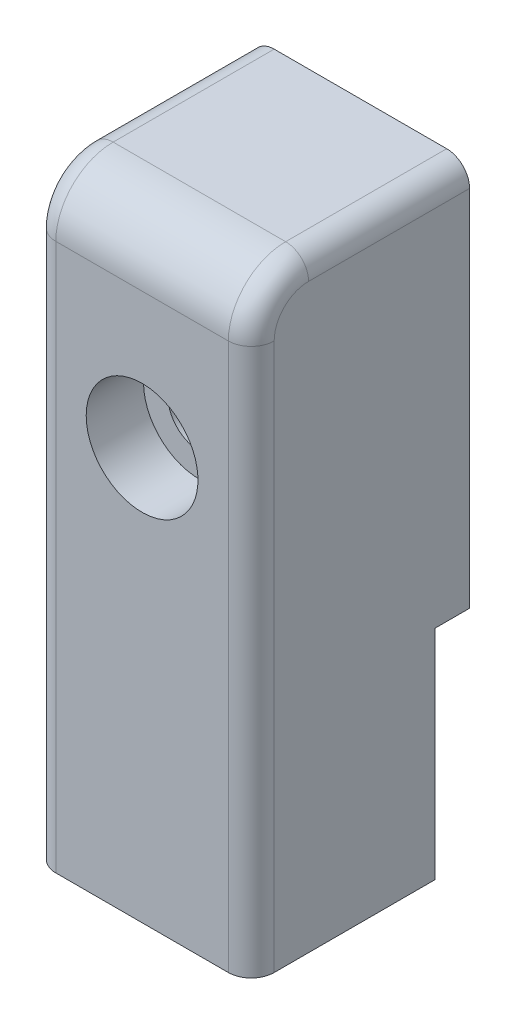
ISO-10303-21;
HEADER;
FILE_DESCRIPTION(('STEP AP214'),'2;1');
FILE_NAME('part.step','',(''),(''),'','','');
FILE_SCHEMA(('AUTOMOTIVE_DESIGN { 1 0 10303 214 1 1 1 1 }'));
ENDSEC;
DATA;
#1=APPLICATION_CONTEXT('core data for automotive mechanical design processes');
#2=APPLICATION_PROTOCOL_DEFINITION('international standard','automotive_design',2000,#1);
#3=PRODUCT_CONTEXT('',#1,'mechanical');
#4=PRODUCT('Part','Part','',(#3));
#5=PRODUCT_RELATED_PRODUCT_CATEGORY('part','',(#4));
#6=PRODUCT_DEFINITION_FORMATION('','',#4);
#7=PRODUCT_DEFINITION_CONTEXT('part definition',#1,'design');
#8=PRODUCT_DEFINITION('design','',#6,#7);
#9=PRODUCT_DEFINITION_SHAPE('','',#8);
#10=(LENGTH_UNIT() NAMED_UNIT(*) SI_UNIT(.MILLI.,.METRE.));
#11=(NAMED_UNIT(*) PLANE_ANGLE_UNIT() SI_UNIT($,.RADIAN.));
#12=(NAMED_UNIT(*) SI_UNIT($,.STERADIAN.) SOLID_ANGLE_UNIT());
#13=UNCERTAINTY_MEASURE_WITH_UNIT(LENGTH_MEASURE(1.E-05),#10,'distance_accuracy_value','');
#14=(GEOMETRIC_REPRESENTATION_CONTEXT(3) GLOBAL_UNCERTAINTY_ASSIGNED_CONTEXT((#13)) GLOBAL_UNIT_ASSIGNED_CONTEXT((#10,
#11,#12)) REPRESENTATION_CONTEXT('',''));
#15=CARTESIAN_POINT('',(0.,0.,0.));
#16=DIRECTION('',(0.,0.,1.));
#17=DIRECTION('',(1.,0.,0.));
#18=AXIS2_PLACEMENT_3D('',#15,#16,#17);
#19=CARTESIAN_POINT('',(276.487457350126,52.72,7.9993613968678));
#20=DIRECTION('',(0.,1.,0.));
#21=DIRECTION('',(1.,0.,0.));
#22=AXIS2_PLACEMENT_3D('',#19,#20,#21);
#23=PLANE('',#22);
#24=DIRECTION('',(0.,0.,1.));
#25=VECTOR('',#24,1.);
#26=CARTESIAN_POINT('',(284.012457350126,52.72,12.7618613968678));
#27=LINE('',#26,#25);
#28=CARTESIAN_POINT('',(284.012457350126,52.72,-1.5256386031322));
#29=VERTEX_POINT('',#28);
#30=CARTESIAN_POINT('',(284.012457350126,52.72,12.5243613968678));
#31=VERTEX_POINT('',#30);
#32=EDGE_CURVE('E223',#29,#31,#27,.T.);
#33=ORIENTED_EDGE('',*,*,#32,.F.);
#34=DIRECTION('',(-1.,0.,0.));
#35=VECTOR('',#34,1.);
#36=CARTESIAN_POINT('',(266.962457350126,52.72,-1.5256386031322));
#37=LINE('',#36,#35);
#38=CARTESIAN_POINT('',(268.962457350126,52.72,-1.5256386031322));
#39=VERTEX_POINT('',#38);
#40=EDGE_CURVE('E11',#29,#39,#37,.T.);
#41=ORIENTED_EDGE('',*,*,#40,.T.);
#42=DIRECTION('',(0.,0.,-1.));
#43=VECTOR('',#42,1.);
#44=CARTESIAN_POINT('',(268.962457350126,52.72,3.2368613968678));
#45=LINE('',#44,#43);
#46=CARTESIAN_POINT('',(268.962457350126,52.72,12.5243613968678));
#47=VERTEX_POINT('',#46);
#48=EDGE_CURVE('E262',#47,#39,#45,.T.);
#49=ORIENTED_EDGE('',*,*,#48,.F.);
#50=DIRECTION('',(-1.,0.,0.));
#51=VECTOR('',#50,1.);
#52=CARTESIAN_POINT('',(271.724957350126,52.72,12.5243613968678));
#53=LINE('',#52,#51);
#54=EDGE_CURVE('E248',#31,#47,#53,.T.);
#55=ORIENTED_EDGE('',*,*,#54,.F.);
#56=EDGE_LOOP('',(#33,#41,#49,#55));
#57=FACE_BOUND('',#56,.T.);
#58=ADVANCED_FACE('F17',(#57),#23,.T.);
#59=CARTESIAN_POINT('',(286.012457350126,0.,17.5243613968678));
#60=DIRECTION('',(1.,0.,0.));
#61=DIRECTION('',(0.,1.,0.));
#62=AXIS2_PLACEMENT_3D('',#59,#60,#61);
#63=PLANE('',#62);
#64=DIRECTION('',(0.,1.,0.));
#65=VECTOR('',#64,1.);
#66=CARTESIAN_POINT('',(286.012457350126,0.,15.5243613968678));
#67=LINE('',#66,#65);
#68=CARTESIAN_POINT('',(286.012457350126,0.,15.5243613968678));
#69=VERTEX_POINT('',#68);
#70=CARTESIAN_POINT('',(286.012457350126,47.72,15.5243613968678));
#71=VERTEX_POINT('',#70);
#72=EDGE_CURVE('E306',#69,#71,#67,.T.);
#73=ORIENTED_EDGE('',*,*,#72,.F.);
#74=DIRECTION('',(0.,0.,1.));
#75=VECTOR('',#74,1.);
#76=CARTESIAN_POINT('',(286.012457350126,0.,-1.5256386031322));
#77=LINE('',#76,#75);
#78=CARTESIAN_POINT('',(286.012457350126,0.,1.4743613968678));
#79=VERTEX_POINT('',#78);
#80=EDGE_CURVE('E167',#79,#69,#77,.T.);
#81=ORIENTED_EDGE('',*,*,#80,.F.);
#82=DIRECTION('',(0.,1.,0.));
#83=VECTOR('',#82,1.);
#84=CARTESIAN_POINT('',(286.012457350126,0.,1.4743613968678));
#85=LINE('',#84,#83);
#86=CARTESIAN_POINT('',(286.012457350126,19.,1.4743613968678));
#87=VERTEX_POINT('',#86);
#88=EDGE_CURVE('E165',#79,#87,#85,.T.);
#89=ORIENTED_EDGE('',*,*,#88,.T.);
#90=DIRECTION('',(0.,0.,-1.));
#91=VECTOR('',#90,1.);
#92=CARTESIAN_POINT('',(286.012457350126,19.,9.4993613968678));
#93=LINE('',#92,#91);
#94=CARTESIAN_POINT('',(286.012457350126,19.,-1.5256386031322));
#95=VERTEX_POINT('',#94);
#96=EDGE_CURVE('E209',#87,#95,#93,.T.);
#97=ORIENTED_EDGE('',*,*,#96,.T.);
#98=DIRECTION('',(0.,1.,0.));
#99=VECTOR('',#98,1.);
#100=CARTESIAN_POINT('',(286.012457350126,0.,-1.5256386031322));
#101=LINE('',#100,#99);
#102=CARTESIAN_POINT('',(286.012457350126,50.72,-1.5256386031322));
#103=VERTEX_POINT('',#102);
#104=EDGE_CURVE('E21',#95,#103,#101,.T.);
#105=ORIENTED_EDGE('',*,*,#104,.T.);
#106=DIRECTION('',(0.,0.,-1.));
#107=VECTOR('',#106,1.);
#108=CARTESIAN_POINT('',(286.012457350126,50.72,12.7618613968678));
#109=LINE('',#108,#107);
#110=CARTESIAN_POINT('',(286.012457350126,50.72,12.5243613968678));
#111=VERTEX_POINT('',#110);
#112=EDGE_CURVE('E228',#111,#103,#109,.T.);
#113=ORIENTED_EDGE('',*,*,#112,.F.);
#114=CARTESIAN_POINT('',(286.012457350126,47.72,12.5243613968678));
#115=DIRECTION('',(-1.,0.,0.));
#116=DIRECTION('',(0.,0.707106781186548,0.707106781186547));
#117=AXIS2_PLACEMENT_3D('',#114,#115,#116);
#118=CIRCLE('',#117,3.);
#119=EDGE_CURVE('E321',#71,#111,#118,.T.);
#120=ORIENTED_EDGE('',*,*,#119,.F.);
#121=EDGE_LOOP('',(#73,#81,#89,#97,#105,#113,#120));
#122=FACE_BOUND('',#121,.T.);
#123=ADVANCED_FACE('F19',(#122),#63,.T.);
#124=CARTESIAN_POINT('',(286.012457350126,0.,-1.5256386031322));
#125=DIRECTION('',(0.,0.,-1.));
#126=DIRECTION('',(0.,-1.,0.));
#127=AXIS2_PLACEMENT_3D('',#124,#125,#126);
#128=PLANE('',#127);
#129=CARTESIAN_POINT('',(276.487457350126,35.885,-1.5256386031322));
#130=DIRECTION('',(0.,0.,1.));
#131=DIRECTION('',(1.,0.,0.));
#132=AXIS2_PLACEMENT_3D('',#129,#130,#131);
#133=CIRCLE('',#132,2.75);
#134=CARTESIAN_POINT('',(273.737457350126,35.885,-1.5256386031322));
#135=VERTEX_POINT('',#134);
#136=EDGE_CURVE('E205',#135,#135,#133,.T.);
#137=ORIENTED_EDGE('',*,*,#136,.T.);
#138=EDGE_LOOP('',(#137));
#139=FACE_BOUND('',#138,.T.);
#140=CARTESIAN_POINT('',(284.012457350126,50.72,-1.5256386031322));
#141=DIRECTION('',(0.,0.,1.));
#142=DIRECTION('',(0.707106781186538,0.707106781186557,0.));
#143=AXIS2_PLACEMENT_3D('',#140,#141,#142);
#144=CIRCLE('',#143,2.);
#145=EDGE_CURVE('E224',#103,#29,#144,.T.);
#146=ORIENTED_EDGE('',*,*,#145,.F.);
#147=ORIENTED_EDGE('',*,*,#104,.F.);
#148=DIRECTION('',(-1.,0.,0.));
#149=VECTOR('',#148,1.);
#150=CARTESIAN_POINT('',(286.012457350126,19.,-1.5256386031322));
#151=LINE('',#150,#149);
#152=CARTESIAN_POINT('',(266.962457350126,19.,-1.5256386031322));
#153=VERTEX_POINT('',#152);
#154=EDGE_CURVE('E207',#95,#153,#151,.T.);
#155=ORIENTED_EDGE('',*,*,#154,.T.);
#156=DIRECTION('',(0.,1.,0.));
#157=VECTOR('',#156,1.);
#158=CARTESIAN_POINT('',(266.962457350126,0.,-1.5256386031322));
#159=LINE('',#158,#157);
#160=CARTESIAN_POINT('',(266.962457350126,50.72,-1.5256386031322));
#161=VERTEX_POINT('',#160);
#162=EDGE_CURVE('E187',#153,#161,#159,.T.);
#163=ORIENTED_EDGE('',*,*,#162,.T.);
#164=CARTESIAN_POINT('',(268.962457350126,50.72,-1.5256386031322));
#165=DIRECTION('',(0.,0.,1.));
#166=DIRECTION('',(-0.707106781186538,0.707106781186557,0.));
#167=AXIS2_PLACEMENT_3D('',#164,#165,#166);
#168=CIRCLE('',#167,2.);
#169=EDGE_CURVE('E260',#39,#161,#168,.T.);
#170=ORIENTED_EDGE('',*,*,#169,.F.);
#171=ORIENTED_EDGE('',*,*,#40,.F.);
#172=EDGE_LOOP('',(#146,#147,#155,#163,#170,#171));
#173=FACE_BOUND('',#172,.T.);
#174=ADVANCED_FACE('F292',(#139,#173),#128,.T.);
#175=CARTESIAN_POINT('',(286.012457350126,19.,1.4743613968678));
#176=DIRECTION('',(0.,1.,0.));
#177=DIRECTION('',(1.,0.,0.));
#178=AXIS2_PLACEMENT_3D('',#175,#176,#177);
#179=PLANE('',#178);
#180=DIRECTION('',(0.,0.,1.));
#181=VECTOR('',#180,1.);
#182=CARTESIAN_POINT('',(266.962457350126,19.,-0.0256386031322042));
#183=LINE('',#182,#181);
#184=CARTESIAN_POINT('',(266.962457350126,19.,1.4743613968678));
#185=VERTEX_POINT('',#184);
#186=EDGE_CURVE('E155',#153,#185,#183,.T.);
#187=ORIENTED_EDGE('',*,*,#186,.F.);
#188=ORIENTED_EDGE('',*,*,#154,.F.);
#189=ORIENTED_EDGE('',*,*,#96,.F.);
#190=DIRECTION('',(-1.,0.,0.));
#191=VECTOR('',#190,1.);
#192=CARTESIAN_POINT('',(286.012457350126,19.,1.4743613968678));
#193=LINE('',#192,#191);
#194=EDGE_CURVE('E202',#87,#185,#193,.T.);
#195=ORIENTED_EDGE('',*,*,#194,.T.);
#196=EDGE_LOOP('',(#187,#188,#189,#195));
#197=FACE_BOUND('',#196,.T.);
#198=ADVANCED_FACE('F361',(#197),#179,.F.);
#199=CARTESIAN_POINT('',(286.012457350126,0.,1.4743613968678));
#200=DIRECTION('',(0.,0.,1.));
#201=DIRECTION('',(1.,0.,0.));
#202=AXIS2_PLACEMENT_3D('',#199,#200,#201);
#203=PLANE('',#202);
#204=DIRECTION('',(0.,-1.,0.));
#205=VECTOR('',#204,1.);
#206=CARTESIAN_POINT('',(266.962457350126,0.,1.4743613968678));
#207=LINE('',#206,#205);
#208=CARTESIAN_POINT('',(266.962457350126,0.,1.4743613968678));
#209=VERTEX_POINT('',#208);
#210=EDGE_CURVE('E145',#185,#209,#207,.T.);
#211=ORIENTED_EDGE('',*,*,#210,.F.);
#212=ORIENTED_EDGE('',*,*,#194,.F.);
#213=ORIENTED_EDGE('',*,*,#88,.F.);
#214=DIRECTION('',(1.,0.,0.));
#215=VECTOR('',#214,1.);
#216=CARTESIAN_POINT('',(281.249957350126,0.,1.4743613968678));
#217=LINE('',#216,#215);
#218=EDGE_CURVE('E157',#209,#79,#217,.T.);
#219=ORIENTED_EDGE('',*,*,#218,.F.);
#220=EDGE_LOOP('',(#211,#212,#213,#219));
#221=FACE_BOUND('',#220,.T.);
#222=ADVANCED_FACE('F159',(#221),#203,.F.);
#223=CARTESIAN_POINT('',(276.487457350126,35.885,7.9993613968678));
#224=DIRECTION('',(0.,0.,-1.));
#225=DIRECTION('',(1.,0.,0.));
#226=AXIS2_PLACEMENT_3D('',#223,#224,#225);
#227=CYLINDRICAL_SURFACE('',#226,2.75);
#228=CARTESIAN_POINT('',(276.487457350126,35.885,12.5243613968678));
#229=DIRECTION('',(0.,0.,-1.));
#230=DIRECTION('',(1.,0.,0.));
#231=AXIS2_PLACEMENT_3D('',#228,#229,#230);
#232=CIRCLE('',#231,2.75);
#233=CARTESIAN_POINT('',(273.737457350126,35.885,12.5243613968678));
#234=VERTEX_POINT('',#233);
#235=EDGE_CURVE('E194',#234,#234,#232,.T.);
#236=ORIENTED_EDGE('',*,*,#235,.F.);
#237=DIRECTION('',(0.,0.,-1.));
#238=VECTOR('',#237,1.);
#239=CARTESIAN_POINT('',(273.737457350126,35.885,7.9993613968678));
#240=LINE('',#239,#238);
#241=EDGE_CURVE('E93',#234,#135,#240,.T.);
#242=ORIENTED_EDGE('',*,*,#241,.T.);
#243=ORIENTED_EDGE('',*,*,#136,.F.);
#244=ORIENTED_EDGE('',*,*,#241,.F.);
#245=EDGE_LOOP('',(#236,#242,#243,#244));
#246=FACE_BOUND('',#245,.T.);
#247=ADVANCED_FACE('F362',(#246),#227,.F.);
#248=CARTESIAN_POINT('',(276.487457350126,35.885,15.0243613968678));
#249=DIRECTION('',(0.,0.,-1.));
#250=DIRECTION('',(1.,0.,0.));
#251=AXIS2_PLACEMENT_3D('',#248,#249,#250);
#252=CYLINDRICAL_SURFACE('',#251,4.875);
#253=CARTESIAN_POINT('',(276.487457350126,35.885,17.5243613968678));
#254=DIRECTION('',(0.,0.,-1.));
#255=DIRECTION('',(1.,0.,0.));
#256=AXIS2_PLACEMENT_3D('',#253,#254,#255);
#257=CIRCLE('',#256,4.875);
#258=CARTESIAN_POINT('',(271.612457350126,35.885,17.5243613968678));
#259=VERTEX_POINT('',#258);
#260=EDGE_CURVE('E175',#259,#259,#257,.T.);
#261=ORIENTED_EDGE('',*,*,#260,.F.);
#262=DIRECTION('',(0.,0.,-1.));
#263=VECTOR('',#262,1.);
#264=CARTESIAN_POINT('',(271.612457350126,35.885,15.0243613968678));
#265=LINE('',#264,#263);
#266=CARTESIAN_POINT('',(271.612457350126,35.885,12.5243613968678));
#267=VERTEX_POINT('',#266);
#268=EDGE_CURVE('E79',#259,#267,#265,.T.);
#269=ORIENTED_EDGE('',*,*,#268,.T.);
#270=CARTESIAN_POINT('',(276.487457350126,35.885,12.5243613968678));
#271=DIRECTION('',(0.,0.,-1.));
#272=DIRECTION('',(1.,0.,0.));
#273=AXIS2_PLACEMENT_3D('',#270,#271,#272);
#274=CIRCLE('',#273,4.875);
#275=EDGE_CURVE('E156',#267,#267,#274,.T.);
#276=ORIENTED_EDGE('',*,*,#275,.T.);
#277=ORIENTED_EDGE('',*,*,#268,.F.);
#278=EDGE_LOOP('',(#261,#269,#276,#277));
#279=FACE_BOUND('',#278,.T.);
#280=ADVANCED_FACE('F371',(#279),#252,.F.);
#281=CARTESIAN_POINT('',(276.487457350126,35.885,12.5243613968678));
#282=DIRECTION('',(0.,0.,-1.));
#283=DIRECTION('',(0.,-1.,0.));
#284=AXIS2_PLACEMENT_3D('',#281,#282,#283);
#285=PLANE('',#284);
#286=ORIENTED_EDGE('',*,*,#235,.T.);
#287=EDGE_LOOP('',(#286));
#288=FACE_BOUND('',#287,.T.);
#289=ORIENTED_EDGE('',*,*,#275,.F.);
#290=EDGE_LOOP('',(#289));
#291=FACE_BOUND('',#290,.T.);
#292=ADVANCED_FACE('F379',(#288,#291),#285,.F.);
#293=CARTESIAN_POINT('',(266.962457350126,0.,-1.5256386031322));
#294=DIRECTION('',(-1.,0.,0.));
#295=DIRECTION('',(0.,0.,1.));
#296=AXIS2_PLACEMENT_3D('',#293,#294,#295);
#297=PLANE('',#296);
#298=DIRECTION('',(0.,-1.,0.));
#299=VECTOR('',#298,1.);
#300=CARTESIAN_POINT('',(266.962457350126,0.,15.5243613968678));
#301=LINE('',#300,#299);
#302=CARTESIAN_POINT('',(266.962457350126,47.72,15.5243613968678));
#303=VERTEX_POINT('',#302);
#304=CARTESIAN_POINT('',(266.962457350126,0.,15.5243613968678));
#305=VERTEX_POINT('',#304);
#306=EDGE_CURVE('E246',#303,#305,#301,.T.);
#307=ORIENTED_EDGE('',*,*,#306,.F.);
#308=CARTESIAN_POINT('',(266.962457350126,47.72,12.5243613968678));
#309=DIRECTION('',(1.,0.,0.));
#310=DIRECTION('',(0.,0.707106781186548,0.707106781186547));
#311=AXIS2_PLACEMENT_3D('',#308,#309,#310);
#312=CIRCLE('',#311,3.);
#313=CARTESIAN_POINT('',(266.962457350126,50.72,12.5243613968678));
#314=VERTEX_POINT('',#313);
#315=EDGE_CURVE('E238',#314,#303,#312,.T.);
#316=ORIENTED_EDGE('',*,*,#315,.F.);
#317=DIRECTION('',(0.,0.,1.));
#318=VECTOR('',#317,1.);
#319=CARTESIAN_POINT('',(266.962457350126,50.72,3.2368613968678));
#320=LINE('',#319,#318);
#321=EDGE_CURVE('E261',#161,#314,#320,.T.);
#322=ORIENTED_EDGE('',*,*,#321,.F.);
#323=ORIENTED_EDGE('',*,*,#162,.F.);
#324=ORIENTED_EDGE('',*,*,#186,.T.);
#325=ORIENTED_EDGE('',*,*,#210,.T.);
#326=DIRECTION('',(0.,0.,-1.));
#327=VECTOR('',#326,1.);
#328=CARTESIAN_POINT('',(266.962457350126,0.,17.5243613968678));
#329=LINE('',#328,#327);
#330=EDGE_CURVE('E146',#305,#209,#329,.T.);
#331=ORIENTED_EDGE('',*,*,#330,.F.);
#332=EDGE_LOOP('',(#307,#316,#322,#323,#324,#325,#331));
#333=FACE_BOUND('',#332,.T.);
#334=ADVANCED_FACE('F148',(#333),#297,.T.);
#335=CARTESIAN_POINT('',(276.487457350126,0.,7.9993613968678));
#336=DIRECTION('',(0.,1.,0.));
#337=DIRECTION('',(1.,0.,0.));
#338=AXIS2_PLACEMENT_3D('',#335,#336,#337);
#339=PLANE('',#338);
#340=CARTESIAN_POINT('',(284.012457350126,0.,15.5243613968678));
#341=DIRECTION('',(0.,1.,0.));
#342=DIRECTION('',(0.70710678118654,0.,0.707106781186555));
#343=AXIS2_PLACEMENT_3D('',#340,#341,#342);
#344=CIRCLE('',#343,2.);
#345=CARTESIAN_POINT('',(284.012457350126,0.,17.5243613968678));
#346=VERTEX_POINT('',#345);
#347=EDGE_CURVE('E275',#346,#69,#344,.T.);
#348=ORIENTED_EDGE('',*,*,#347,.F.);
#349=DIRECTION('',(-1.,0.,0.));
#350=VECTOR('',#349,1.);
#351=CARTESIAN_POINT('',(286.012457350126,0.,17.5243613968678));
#352=LINE('',#351,#350);
#353=CARTESIAN_POINT('',(268.962457350126,0.,17.5243613968678));
#354=VERTEX_POINT('',#353);
#355=EDGE_CURVE('E181',#346,#354,#352,.T.);
#356=ORIENTED_EDGE('',*,*,#355,.T.);
#357=CARTESIAN_POINT('',(268.962457350126,0.,15.5243613968678));
#358=DIRECTION('',(0.,1.,0.));
#359=DIRECTION('',(-0.707106781186552,0.,0.707106781186543));
#360=AXIS2_PLACEMENT_3D('',#357,#358,#359);
#361=CIRCLE('',#360,2.);
#362=EDGE_CURVE('E174',#305,#354,#361,.T.);
#363=ORIENTED_EDGE('',*,*,#362,.F.);
#364=ORIENTED_EDGE('',*,*,#330,.T.);
#365=ORIENTED_EDGE('',*,*,#218,.T.);
#366=ORIENTED_EDGE('',*,*,#80,.T.);
#367=EDGE_LOOP('',(#348,#356,#363,#364,#365,#366));
#368=FACE_BOUND('',#367,.T.);
#369=ADVANCED_FACE('F168',(#368),#339,.F.);
#370=CARTESIAN_POINT('',(266.962457350126,0.,17.5243613968678));
#371=DIRECTION('',(0.,0.,1.));
#372=DIRECTION('',(1.,0.,0.));
#373=AXIS2_PLACEMENT_3D('',#370,#371,#372);
#374=PLANE('',#373);
#375=ORIENTED_EDGE('',*,*,#260,.T.);
#376=EDGE_LOOP('',(#375));
#377=FACE_BOUND('',#376,.T.);
#378=DIRECTION('',(0.,-1.,0.));
#379=VECTOR('',#378,1.);
#380=CARTESIAN_POINT('',(284.012457350126,0.,17.5243613968678));
#381=LINE('',#380,#379);
#382=CARTESIAN_POINT('',(284.012457350126,47.72,17.5243613968678));
#383=VERTEX_POINT('',#382);
#384=EDGE_CURVE('E302',#383,#346,#381,.T.);
#385=ORIENTED_EDGE('',*,*,#384,.F.);
#386=DIRECTION('',(1.,0.,0.));
#387=VECTOR('',#386,1.);
#388=CARTESIAN_POINT('',(271.724957350126,47.72,17.5243613968678));
#389=LINE('',#388,#387);
#390=CARTESIAN_POINT('',(268.962457350126,47.72,17.5243613968678));
#391=VERTEX_POINT('',#390);
#392=EDGE_CURVE('E251',#391,#383,#389,.T.);
#393=ORIENTED_EDGE('',*,*,#392,.F.);
#394=DIRECTION('',(0.,1.,0.));
#395=VECTOR('',#394,1.);
#396=CARTESIAN_POINT('',(268.962457350126,0.,17.5243613968678));
#397=LINE('',#396,#395);
#398=EDGE_CURVE('E244',#354,#391,#397,.T.);
#399=ORIENTED_EDGE('',*,*,#398,.F.);
#400=ORIENTED_EDGE('',*,*,#355,.F.);
#401=EDGE_LOOP('',(#385,#393,#399,#400));
#402=FACE_BOUND('',#401,.T.);
#403=ADVANCED_FACE('F280',(#377,#402),#374,.T.);
#404=CARTESIAN_POINT('',(268.962457350126,50.72,3.2368613968678));
#405=DIRECTION('',(0.,0.,1.));
#406=DIRECTION('',(-0.707106781186538,0.707106781186557,0.));
#407=AXIS2_PLACEMENT_3D('',#404,#405,#406);
#408=CYLINDRICAL_SURFACE('',#407,2.);
#409=ORIENTED_EDGE('',*,*,#169,.T.);
#410=ORIENTED_EDGE('',*,*,#321,.T.);
#411=CARTESIAN_POINT('',(268.962457350126,50.72,12.5243613968678));
#412=DIRECTION('',(0.,0.,-1.));
#413=DIRECTION('',(-1.,0.,0.));
#414=AXIS2_PLACEMENT_3D('',#411,#412,#413);
#415=CIRCLE('',#414,2.);
#416=EDGE_CURVE('E230',#314,#47,#415,.T.);
#417=ORIENTED_EDGE('',*,*,#416,.T.);
#418=ORIENTED_EDGE('',*,*,#48,.T.);
#419=EDGE_LOOP('',(#409,#410,#417,#418));
#420=FACE_BOUND('',#419,.T.);
#421=ADVANCED_FACE('F291',(#420),#408,.T.);
#422=CARTESIAN_POINT('',(271.724957350126,47.72,12.5243613968678));
#423=DIRECTION('',(1.,0.,0.));
#424=DIRECTION('',(0.,0.707106781186548,0.707106781186548));
#425=AXIS2_PLACEMENT_3D('',#422,#423,#424);
#426=CYLINDRICAL_SURFACE('',#425,5.);
#427=CARTESIAN_POINT('',(284.012457350126,47.72,12.5243613968678));
#428=DIRECTION('',(-1.,0.,0.));
#429=DIRECTION('',(0.,0.,1.));
#430=AXIS2_PLACEMENT_3D('',#427,#428,#429);
#431=CIRCLE('',#430,5.);
#432=EDGE_CURVE('E329',#383,#31,#431,.T.);
#433=ORIENTED_EDGE('',*,*,#432,.T.);
#434=ORIENTED_EDGE('',*,*,#54,.T.);
#435=CARTESIAN_POINT('',(268.962457350126,47.72,12.5243613968678));
#436=DIRECTION('',(1.,0.,0.));
#437=DIRECTION('',(0.,1.,0.));
#438=AXIS2_PLACEMENT_3D('',#435,#436,#437);
#439=CIRCLE('',#438,5.);
#440=EDGE_CURVE('E232',#47,#391,#439,.T.);
#441=ORIENTED_EDGE('',*,*,#440,.T.);
#442=ORIENTED_EDGE('',*,*,#392,.T.);
#443=EDGE_LOOP('',(#433,#434,#441,#442));
#444=FACE_BOUND('',#443,.T.);
#445=ADVANCED_FACE('F338',(#444),#426,.T.);
#446=CARTESIAN_POINT('',(268.962457350126,0.,15.5243613968678));
#447=DIRECTION('',(0.,1.,0.));
#448=DIRECTION('',(-0.707106781186552,0.,0.707106781186543));
#449=AXIS2_PLACEMENT_3D('',#446,#447,#448);
#450=CYLINDRICAL_SURFACE('',#449,2.);
#451=ORIENTED_EDGE('',*,*,#362,.T.);
#452=ORIENTED_EDGE('',*,*,#398,.T.);
#453=CARTESIAN_POINT('',(268.962457350126,47.72,15.5243613968678));
#454=DIRECTION('',(0.,-1.,0.));
#455=DIRECTION('',(0.,0.,1.));
#456=AXIS2_PLACEMENT_3D('',#453,#454,#455);
#457=CIRCLE('',#456,2.);
#458=EDGE_CURVE('E245',#391,#303,#457,.T.);
#459=ORIENTED_EDGE('',*,*,#458,.T.);
#460=ORIENTED_EDGE('',*,*,#306,.T.);
#461=EDGE_LOOP('',(#451,#452,#459,#460));
#462=FACE_BOUND('',#461,.T.);
#463=ADVANCED_FACE('F284',(#462),#450,.T.);
#464=CARTESIAN_POINT('',(268.962457350126,47.72,12.5243613968678));
#465=DIRECTION('',(1.,0.,0.));
#466=DIRECTION('',(0.,0.,-1.));
#467=AXIS2_PLACEMENT_3D('',#464,#465,#466);
#468=TOROIDAL_SURFACE('',#467,3.,2.);
#469=ORIENTED_EDGE('',*,*,#315,.T.);
#470=ORIENTED_EDGE('',*,*,#458,.F.);
#471=ORIENTED_EDGE('',*,*,#440,.F.);
#472=ORIENTED_EDGE('',*,*,#416,.F.);
#473=EDGE_LOOP('',(#469,#470,#471,#472));
#474=FACE_BOUND('',#473,.T.);
#475=ADVANCED_FACE('F287',(#474),#468,.T.);
#476=CARTESIAN_POINT('',(284.012457350126,50.72,12.7618613968678));
#477=DIRECTION('',(0.,0.,-1.));
#478=DIRECTION('',(0.707106781186538,0.707106781186557,0.));
#479=AXIS2_PLACEMENT_3D('',#476,#477,#478);
#480=CYLINDRICAL_SURFACE('',#479,2.);
#481=ORIENTED_EDGE('',*,*,#145,.T.);
#482=ORIENTED_EDGE('',*,*,#32,.T.);
#483=CARTESIAN_POINT('',(284.012457350126,50.72,12.5243613968678));
#484=DIRECTION('',(0.,0.,-1.));
#485=DIRECTION('',(0.,1.,0.));
#486=AXIS2_PLACEMENT_3D('',#483,#484,#485);
#487=CIRCLE('',#486,2.);
#488=EDGE_CURVE('E319',#31,#111,#487,.T.);
#489=ORIENTED_EDGE('',*,*,#488,.T.);
#490=ORIENTED_EDGE('',*,*,#112,.T.);
#491=EDGE_LOOP('',(#481,#482,#489,#490));
#492=FACE_BOUND('',#491,.T.);
#493=ADVANCED_FACE('F305',(#492),#480,.T.);
#494=CARTESIAN_POINT('',(284.012457350126,0.,15.5243613968678));
#495=DIRECTION('',(0.,1.,0.));
#496=DIRECTION('',(0.70710678118654,0.,0.707106781186555));
#497=AXIS2_PLACEMENT_3D('',#494,#495,#496);
#498=CYLINDRICAL_SURFACE('',#497,2.);
#499=ORIENTED_EDGE('',*,*,#347,.T.);
#500=ORIENTED_EDGE('',*,*,#72,.T.);
#501=CARTESIAN_POINT('',(284.012457350126,47.72,15.5243613968678));
#502=DIRECTION('',(0.,-1.,0.));
#503=DIRECTION('',(1.,0.,0.));
#504=AXIS2_PLACEMENT_3D('',#501,#502,#503);
#505=CIRCLE('',#504,2.);
#506=EDGE_CURVE('E324',#71,#383,#505,.T.);
#507=ORIENTED_EDGE('',*,*,#506,.T.);
#508=ORIENTED_EDGE('',*,*,#384,.T.);
#509=EDGE_LOOP('',(#499,#500,#507,#508));
#510=FACE_BOUND('',#509,.T.);
#511=ADVANCED_FACE('F433',(#510),#498,.T.);
#512=CARTESIAN_POINT('',(284.012457350126,47.72,12.5243613968678));
#513=DIRECTION('',(1.,0.,0.));
#514=DIRECTION('',(0.,0.,-1.));
#515=AXIS2_PLACEMENT_3D('',#512,#513,#514);
#516=TOROIDAL_SURFACE('',#515,3.,2.);
#517=ORIENTED_EDGE('',*,*,#432,.F.);
#518=ORIENTED_EDGE('',*,*,#506,.F.);
#519=ORIENTED_EDGE('',*,*,#119,.T.);
#520=ORIENTED_EDGE('',*,*,#488,.F.);
#521=EDGE_LOOP('',(#517,#518,#519,#520));
#522=FACE_BOUND('',#521,.T.);
#523=ADVANCED_FACE('F343',(#522),#516,.T.);
#524=CLOSED_SHELL('',(#58,#123,#174,#198,#222,#247,#280,#292,#334,#369,#403,#421,#445,#463,#475,
#493,#511,#523));
#525=MANIFOLD_SOLID_BREP('B1',#524);
#526=ADVANCED_BREP_SHAPE_REPRESENTATION('',(#18,#525),#14);
#527=SHAPE_DEFINITION_REPRESENTATION(#9,#526);
ENDSEC;
END-ISO-10303-21;
